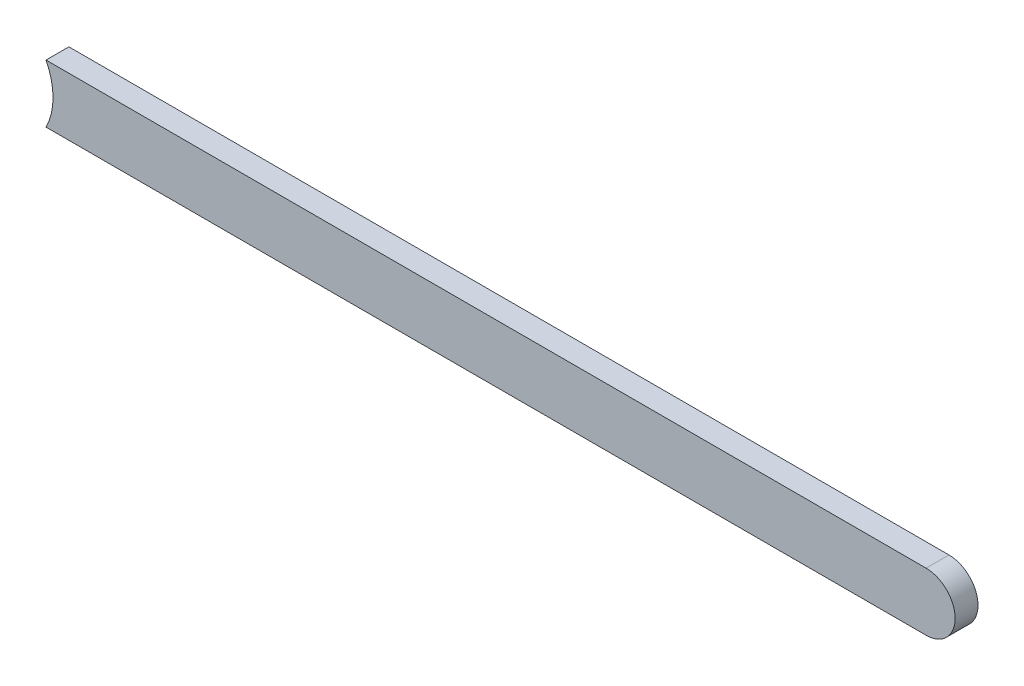
ISO-10303-21;
HEADER;
FILE_DESCRIPTION(('STEP AP214'),'2;1');
FILE_NAME('part.step','',(''),(''),'','','');
FILE_SCHEMA(('AUTOMOTIVE_DESIGN { 1 0 10303 214 1 1 1 1 }'));
ENDSEC;
DATA;
#1=APPLICATION_CONTEXT('core data for automotive mechanical design processes');
#2=APPLICATION_PROTOCOL_DEFINITION('international standard','automotive_design',2000,#1);
#3=PRODUCT_CONTEXT('',#1,'mechanical');
#4=PRODUCT('Part','Part','',(#3));
#5=PRODUCT_RELATED_PRODUCT_CATEGORY('part','',(#4));
#6=PRODUCT_DEFINITION_FORMATION('','',#4);
#7=PRODUCT_DEFINITION_CONTEXT('part definition',#1,'design');
#8=PRODUCT_DEFINITION('design','',#6,#7);
#9=PRODUCT_DEFINITION_SHAPE('','',#8);
#10=(LENGTH_UNIT() NAMED_UNIT(*) SI_UNIT(.MILLI.,.METRE.));
#11=(NAMED_UNIT(*) PLANE_ANGLE_UNIT() SI_UNIT($,.RADIAN.));
#12=(NAMED_UNIT(*) SI_UNIT($,.STERADIAN.) SOLID_ANGLE_UNIT());
#13=UNCERTAINTY_MEASURE_WITH_UNIT(LENGTH_MEASURE(1.E-05),#10,'distance_accuracy_value','');
#14=(GEOMETRIC_REPRESENTATION_CONTEXT(3) GLOBAL_UNCERTAINTY_ASSIGNED_CONTEXT((#13)) GLOBAL_UNIT_ASSIGNED_CONTEXT((#10,
#11,#12)) REPRESENTATION_CONTEXT('',''));
#15=CARTESIAN_POINT('',(0.,0.,0.));
#16=DIRECTION('',(0.,0.,1.));
#17=DIRECTION('',(1.,0.,0.));
#18=AXIS2_PLACEMENT_3D('',#15,#16,#17);
#19=CARTESIAN_POINT('',(129.518202090858,100.965,0.));
#20=DIRECTION('',(0.,1.,0.));
#21=DIRECTION('',(1.,0.,0.));
#22=AXIS2_PLACEMENT_3D('',#19,#20,#21);
#23=PLANE('',#22);
#24=DIRECTION('',(1.,0.,0.));
#25=VECTOR('',#24,1.);
#26=CARTESIAN_POINT('',(129.0247356,100.965,0.1999996));
#27=LINE('',#26,#25);
#28=CARTESIAN_POINT('',(129.518202090858,100.965,0.1999996));
#29=VERTEX_POINT('',#28);
#30=CARTESIAN_POINT('',(137.2122732,100.965,0.1999996));
#31=VERTEX_POINT('',#30);
#32=EDGE_CURVE('E11',#29,#31,#27,.T.);
#33=ORIENTED_EDGE('',*,*,#32,.F.);
#34=DIRECTION('',(0.,0.,1.));
#35=VECTOR('',#34,1.);
#36=CARTESIAN_POINT('',(129.518202090858,100.965,0.));
#37=LINE('',#36,#35);
#38=CARTESIAN_POINT('',(129.518202090858,100.965,0.));
#39=VERTEX_POINT('',#38);
#40=EDGE_CURVE('E24',#39,#29,#37,.T.);
#41=ORIENTED_EDGE('',*,*,#40,.F.);
#42=DIRECTION('',(1.,0.,0.));
#43=VECTOR('',#42,1.);
#44=CARTESIAN_POINT('',(129.0247356,100.965,0.));
#45=LINE('',#44,#43);
#46=CARTESIAN_POINT('',(137.2122732,100.965,0.));
#47=VERTEX_POINT('',#46);
#48=EDGE_CURVE('E82',#39,#47,#45,.T.);
#49=ORIENTED_EDGE('',*,*,#48,.T.);
#50=DIRECTION('',(0.,0.,1.));
#51=VECTOR('',#50,1.);
#52=CARTESIAN_POINT('',(137.2122732,100.965,0.));
#53=LINE('',#52,#51);
#54=EDGE_CURVE('E37',#47,#31,#53,.T.);
#55=ORIENTED_EDGE('',*,*,#54,.T.);
#56=EDGE_LOOP('',(#33,#41,#49,#55));
#57=FACE_BOUND('',#56,.T.);
#58=ADVANCED_FACE('F17',(#57),#23,.F.);
#59=CARTESIAN_POINT('',(137.2122732,101.219,0.));
#60=DIRECTION('',(0.,0.,-1.));
#61=DIRECTION('',(1.11896493820486E-13,-1.,0.));
#62=AXIS2_PLACEMENT_3D('',#59,#60,#61);
#63=CYLINDRICAL_SURFACE('',#62,0.254000000000005);
#64=CARTESIAN_POINT('',(137.2122732,101.219,0.1999996));
#65=DIRECTION('',(0.,0.,1.));
#66=DIRECTION('',(1.11896493820486E-13,-1.,0.));
#67=AXIS2_PLACEMENT_3D('',#64,#65,#66);
#68=CIRCLE('',#67,0.254000000000005);
#69=CARTESIAN_POINT('',(137.2122732,101.473,0.1999996));
#70=VERTEX_POINT('',#69);
#71=EDGE_CURVE('E97',#31,#70,#68,.T.);
#72=ORIENTED_EDGE('',*,*,#71,.F.);
#73=ORIENTED_EDGE('',*,*,#54,.F.);
#74=CARTESIAN_POINT('',(137.2122732,101.219,0.));
#75=DIRECTION('',(0.,0.,1.));
#76=DIRECTION('',(1.11896493820486E-13,-1.,0.));
#77=AXIS2_PLACEMENT_3D('',#74,#75,#76);
#78=CIRCLE('',#77,0.254000000000005);
#79=CARTESIAN_POINT('',(137.2122732,101.473,0.));
#80=VERTEX_POINT('',#79);
#81=EDGE_CURVE('E94',#47,#80,#78,.T.);
#82=ORIENTED_EDGE('',*,*,#81,.T.);
#83=DIRECTION('',(0.,0.,1.));
#84=VECTOR('',#83,1.);
#85=CARTESIAN_POINT('',(137.2122732,101.473,0.));
#86=LINE('',#85,#84);
#87=EDGE_CURVE('E92',#80,#70,#86,.T.);
#88=ORIENTED_EDGE('',*,*,#87,.T.);
#89=EDGE_LOOP('',(#72,#73,#82,#88));
#90=FACE_BOUND('',#89,.T.);
#91=ADVANCED_FACE('F103',(#90),#63,.T.);
#92=CARTESIAN_POINT('',(137.2122732,101.473,0.));
#93=DIRECTION('',(0.,-1.,0.));
#94=DIRECTION('',(-1.,0.,0.));
#95=AXIS2_PLACEMENT_3D('',#92,#93,#94);
#96=PLANE('',#95);
#97=DIRECTION('',(-1.,0.,0.));
#98=VECTOR('',#97,1.);
#99=CARTESIAN_POINT('',(137.2122732,101.473,0.1999996));
#100=LINE('',#99,#98);
#101=CARTESIAN_POINT('',(129.518202090858,101.473,0.1999996));
#102=VERTEX_POINT('',#101);
#103=EDGE_CURVE('E89',#70,#102,#100,.T.);
#104=ORIENTED_EDGE('',*,*,#103,.F.);
#105=ORIENTED_EDGE('',*,*,#87,.F.);
#106=DIRECTION('',(-1.,0.,0.));
#107=VECTOR('',#106,1.);
#108=CARTESIAN_POINT('',(137.2122732,101.473,0.));
#109=LINE('',#108,#107);
#110=CARTESIAN_POINT('',(129.518202090858,101.473,0.));
#111=VERTEX_POINT('',#110);
#112=EDGE_CURVE('E87',#80,#111,#109,.T.);
#113=ORIENTED_EDGE('',*,*,#112,.T.);
#114=DIRECTION('',(0.,0.,1.));
#115=VECTOR('',#114,1.);
#116=CARTESIAN_POINT('',(129.518202090858,101.473,0.));
#117=LINE('',#116,#115);
#118=EDGE_CURVE('E69',#111,#102,#117,.T.);
#119=ORIENTED_EDGE('',*,*,#118,.T.);
#120=EDGE_LOOP('',(#104,#105,#113,#119));
#121=FACE_BOUND('',#120,.T.);
#122=ADVANCED_FACE('F108',(#121),#96,.F.);
#123=CARTESIAN_POINT('',(129.0247356,101.219,0.));
#124=DIRECTION('',(0.,0.,-1.));
#125=DIRECTION('',(1.,0.,0.));
#126=AXIS2_PLACEMENT_3D('',#123,#124,#125);
#127=CYLINDRICAL_SURFACE('',#126,0.55500016);
#128=DIRECTION('',(0.,0.,1.));
#129=VECTOR('',#128,1.);
#130=CARTESIAN_POINT('',(129.57973576,101.219,0.));
#131=LINE('',#130,#129);
#132=CARTESIAN_POINT('',(129.57973576,101.219,0.));
#133=VERTEX_POINT('',#132);
#134=CARTESIAN_POINT('',(129.57973576,101.219,0.1999996));
#135=VERTEX_POINT('',#134);
#136=EDGE_CURVE('E59',#133,#135,#131,.T.);
#137=ORIENTED_EDGE('',*,*,#136,.T.);
#138=CARTESIAN_POINT('',(129.0247356,101.219,0.1999996));
#139=DIRECTION('',(0.,0.,1.));
#140=DIRECTION('',(1.,0.,0.));
#141=AXIS2_PLACEMENT_3D('',#138,#139,#140);
#142=CIRCLE('',#141,0.55500016);
#143=EDGE_CURVE('E70',#135,#102,#142,.T.);
#144=ORIENTED_EDGE('',*,*,#143,.T.);
#145=ORIENTED_EDGE('',*,*,#118,.F.);
#146=CARTESIAN_POINT('',(129.0247356,101.219,0.));
#147=DIRECTION('',(0.,0.,1.));
#148=DIRECTION('',(1.,0.,0.));
#149=AXIS2_PLACEMENT_3D('',#146,#147,#148);
#150=CIRCLE('',#149,0.55500016);
#151=EDGE_CURVE('E73',#133,#111,#150,.T.);
#152=ORIENTED_EDGE('',*,*,#151,.F.);
#153=EDGE_LOOP('',(#137,#144,#145,#152));
#154=FACE_BOUND('',#153,.T.);
#155=ADVANCED_FACE('F74',(#154),#127,.F.);
#156=CARTESIAN_POINT('',(129.0247356,101.219,0.));
#157=DIRECTION('',(0.,0.,-1.));
#158=DIRECTION('',(1.,0.,0.));
#159=AXIS2_PLACEMENT_3D('',#156,#157,#158);
#160=CYLINDRICAL_SURFACE('',#159,0.55500016);
#161=ORIENTED_EDGE('',*,*,#40,.T.);
#162=CARTESIAN_POINT('',(129.0247356,101.219,0.1999996));
#163=DIRECTION('',(0.,0.,1.));
#164=DIRECTION('',(1.,0.,0.));
#165=AXIS2_PLACEMENT_3D('',#162,#163,#164);
#166=CIRCLE('',#165,0.55500016);
#167=EDGE_CURVE('E65',#29,#135,#166,.T.);
#168=ORIENTED_EDGE('',*,*,#167,.T.);
#169=ORIENTED_EDGE('',*,*,#136,.F.);
#170=EDGE_CURVE('E63',#39,#133,#150,.T.);
#171=ORIENTED_EDGE('',*,*,#170,.F.);
#172=EDGE_LOOP('',(#161,#168,#169,#171));
#173=FACE_BOUND('',#172,.T.);
#174=ADVANCED_FACE('F61',(#173),#160,.F.);
#175=CARTESIAN_POINT('',(129.0247356,100.965,0.));
#176=DIRECTION('',(0.,0.,-1.));
#177=DIRECTION('',(-1.,0.,0.));
#178=AXIS2_PLACEMENT_3D('',#175,#176,#177);
#179=PLANE('',#178);
#180=ORIENTED_EDGE('',*,*,#48,.F.);
#181=ORIENTED_EDGE('',*,*,#170,.T.);
#182=ORIENTED_EDGE('',*,*,#151,.T.);
#183=ORIENTED_EDGE('',*,*,#112,.F.);
#184=ORIENTED_EDGE('',*,*,#81,.F.);
#185=EDGE_LOOP('',(#180,#181,#182,#183,#184));
#186=FACE_BOUND('',#185,.T.);
#187=ADVANCED_FACE('F80',(#186),#179,.T.);
#188=CARTESIAN_POINT('',(129.0247356,100.965,0.1999996));
#189=DIRECTION('',(0.,0.,-1.));
#190=DIRECTION('',(-1.,0.,0.));
#191=AXIS2_PLACEMENT_3D('',#188,#189,#190);
#192=PLANE('',#191);
#193=ORIENTED_EDGE('',*,*,#167,.F.);
#194=ORIENTED_EDGE('',*,*,#32,.T.);
#195=ORIENTED_EDGE('',*,*,#71,.T.);
#196=ORIENTED_EDGE('',*,*,#103,.T.);
#197=ORIENTED_EDGE('',*,*,#143,.F.);
#198=EDGE_LOOP('',(#193,#194,#195,#196,#197));
#199=FACE_BOUND('',#198,.T.);
#200=ADVANCED_FACE('F106',(#199),#192,.F.);
#201=CLOSED_SHELL('',(#58,#91,#122,#155,#174,#187,#200));
#202=MANIFOLD_SOLID_BREP('B1',#201);
#203=ADVANCED_BREP_SHAPE_REPRESENTATION('',(#18,#202),#14);
#204=SHAPE_DEFINITION_REPRESENTATION(#9,#203);
ENDSEC;
END-ISO-10303-21;
